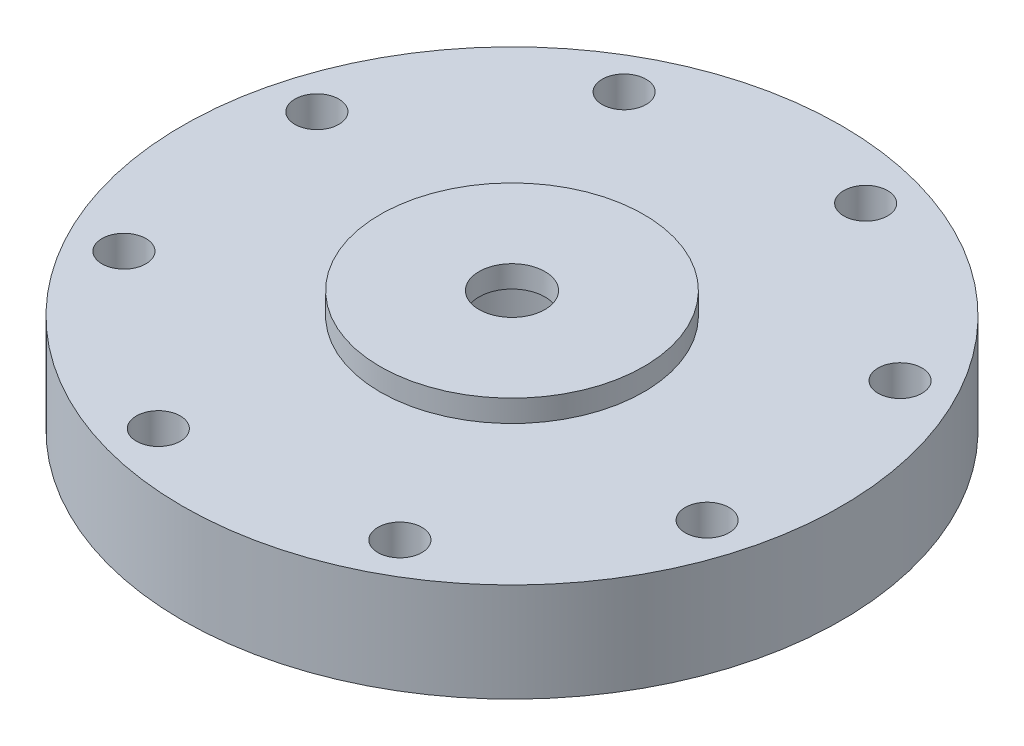
ISO-10303-21;
HEADER;
FILE_DESCRIPTION(('STEP AP214'),'2;1');
FILE_NAME('part.step','',(''),(''),'','','');
FILE_SCHEMA(('AUTOMOTIVE_DESIGN { 1 0 10303 214 1 1 1 1 }'));
ENDSEC;
DATA;
#1=APPLICATION_CONTEXT('core data for automotive mechanical design processes');
#2=APPLICATION_PROTOCOL_DEFINITION('international standard','automotive_design',2000,#1);
#3=PRODUCT_CONTEXT('',#1,'mechanical');
#4=PRODUCT('Part','Part','',(#3));
#5=PRODUCT_RELATED_PRODUCT_CATEGORY('part','',(#4));
#6=PRODUCT_DEFINITION_FORMATION('','',#4);
#7=PRODUCT_DEFINITION_CONTEXT('part definition',#1,'design');
#8=PRODUCT_DEFINITION('design','',#6,#7);
#9=PRODUCT_DEFINITION_SHAPE('','',#8);
#10=(LENGTH_UNIT() NAMED_UNIT(*) SI_UNIT(.MILLI.,.METRE.));
#11=(NAMED_UNIT(*) PLANE_ANGLE_UNIT() SI_UNIT($,.RADIAN.));
#12=(NAMED_UNIT(*) SI_UNIT($,.STERADIAN.) SOLID_ANGLE_UNIT());
#13=UNCERTAINTY_MEASURE_WITH_UNIT(LENGTH_MEASURE(1.E-05),#10,'distance_accuracy_value','');
#14=(GEOMETRIC_REPRESENTATION_CONTEXT(3) GLOBAL_UNCERTAINTY_ASSIGNED_CONTEXT((#13)) GLOBAL_UNIT_ASSIGNED_CONTEXT((#10,
#11,#12)) REPRESENTATION_CONTEXT('',''));
#15=CARTESIAN_POINT('',(0.,0.,0.));
#16=DIRECTION('',(0.,0.,1.));
#17=DIRECTION('',(1.,0.,0.));
#18=AXIS2_PLACEMENT_3D('',#15,#16,#17);
#19=CARTESIAN_POINT('',(0.,2.25,0.));
#20=DIRECTION('',(0.,-1.,0.));
#21=DIRECTION('',(0.,0.,-1.));
#22=AXIS2_PLACEMENT_3D('',#19,#20,#21);
#23=CYLINDRICAL_SURFACE('',#22,15.);
#24=CARTESIAN_POINT('',(0.,2.25,0.));
#25=DIRECTION('',(0.,1.,0.));
#26=DIRECTION('',(0.,0.,1.));
#27=AXIS2_PLACEMENT_3D('',#24,#25,#26);
#28=CIRCLE('',#27,15.);
#29=CARTESIAN_POINT('',(0.,2.25,15.));
#30=VERTEX_POINT('',#29);
#31=EDGE_CURVE('E45',#30,#30,#28,.T.);
#32=ORIENTED_EDGE('',*,*,#31,.F.);
#33=EDGE_LOOP('',(#32));
#34=FACE_BOUND('',#33,.T.);
#35=CARTESIAN_POINT('',(0.,-2.25,0.));
#36=DIRECTION('',(0.,1.,0.));
#37=DIRECTION('',(0.,0.,1.));
#38=AXIS2_PLACEMENT_3D('',#35,#36,#37);
#39=CIRCLE('',#38,15.);
#40=CARTESIAN_POINT('',(0.,-2.25,15.));
#41=VERTEX_POINT('',#40);
#42=EDGE_CURVE('E51',#41,#41,#39,.T.);
#43=ORIENTED_EDGE('',*,*,#42,.T.);
#44=EDGE_LOOP('',(#43));
#45=FACE_BOUND('',#44,.T.);
#46=ADVANCED_FACE('F37',(#34,#45),#23,.T.);
#47=CARTESIAN_POINT('',(0.,2.25,0.));
#48=DIRECTION('',(0.,1.,0.));
#49=DIRECTION('',(0.,0.,1.));
#50=AXIS2_PLACEMENT_3D('',#47,#48,#49);
#51=PLANE('',#50);
#52=CARTESIAN_POINT('',(-3.60811723817874,2.25,12.4892549816055));
#53=DIRECTION('',(0.,1.,0.));
#54=DIRECTION('',(0.,0.,1.));
#55=AXIS2_PLACEMENT_3D('',#52,#53,#54);
#56=CIRCLE('',#55,1.);
#57=CARTESIAN_POINT('',(-3.60811723817874,2.25,13.4892549816055));
#58=VERTEX_POINT('',#57);
#59=EDGE_CURVE('E129',#58,#58,#56,.T.);
#60=ORIENTED_EDGE('',*,*,#59,.F.);
#61=EDGE_LOOP('',(#60));
#62=FACE_BOUND('',#61,.T.);
#63=CARTESIAN_POINT('',(6.27991272302886,2.25,11.3825610558934));
#64=DIRECTION('',(0.,1.,0.));
#65=DIRECTION('',(0.,0.,1.));
#66=AXIS2_PLACEMENT_3D('',#63,#64,#65);
#67=CIRCLE('',#66,1.);
#68=CARTESIAN_POINT('',(6.27991272302886,2.25,12.3825610558934));
#69=VERTEX_POINT('',#68);
#70=EDGE_CURVE('E133',#69,#69,#67,.T.);
#71=ORIENTED_EDGE('',*,*,#70,.F.);
#72=EDGE_LOOP('',(#71));
#73=FACE_BOUND('',#72,.T.);
#74=CARTESIAN_POINT('',(12.4892549816055,2.25,3.6081172381787));
#75=DIRECTION('',(0.,1.,0.));
#76=DIRECTION('',(0.,0.,1.));
#77=AXIS2_PLACEMENT_3D('',#74,#75,#76);
#78=CIRCLE('',#77,1.);
#79=CARTESIAN_POINT('',(12.4892549816055,2.25,4.6081172381787));
#80=VERTEX_POINT('',#79);
#81=EDGE_CURVE('E137',#80,#80,#78,.T.);
#82=ORIENTED_EDGE('',*,*,#81,.F.);
#83=EDGE_LOOP('',(#82));
#84=FACE_BOUND('',#83,.T.);
#85=CARTESIAN_POINT('',(11.3825610558933,2.25,-6.2799127230289));
#86=DIRECTION('',(0.,1.,0.));
#87=DIRECTION('',(0.,0.,1.));
#88=AXIS2_PLACEMENT_3D('',#85,#86,#87);
#89=CIRCLE('',#88,1.);
#90=CARTESIAN_POINT('',(11.3825610558933,2.25,-5.2799127230289));
#91=VERTEX_POINT('',#90);
#92=EDGE_CURVE('E141',#91,#91,#89,.T.);
#93=ORIENTED_EDGE('',*,*,#92,.F.);
#94=EDGE_LOOP('',(#93));
#95=FACE_BOUND('',#94,.T.);
#96=CARTESIAN_POINT('',(3.60811723817866,2.25,-12.4892549816055));
#97=DIRECTION('',(0.,1.,0.));
#98=DIRECTION('',(0.,0.,1.));
#99=AXIS2_PLACEMENT_3D('',#96,#97,#98);
#100=CIRCLE('',#99,1.);
#101=CARTESIAN_POINT('',(3.60811723817866,2.25,-11.4892549816055));
#102=VERTEX_POINT('',#101);
#103=EDGE_CURVE('E145',#102,#102,#100,.T.);
#104=ORIENTED_EDGE('',*,*,#103,.F.);
#105=EDGE_LOOP('',(#104));
#106=FACE_BOUND('',#105,.T.);
#107=CARTESIAN_POINT('',(-6.27991272302894,2.25,-11.3825610558933));
#108=DIRECTION('',(0.,1.,0.));
#109=DIRECTION('',(0.,0.,1.));
#110=AXIS2_PLACEMENT_3D('',#107,#108,#109);
#111=CIRCLE('',#110,1.);
#112=CARTESIAN_POINT('',(-6.27991272302894,2.25,-10.3825610558933));
#113=VERTEX_POINT('',#112);
#114=EDGE_CURVE('E149',#113,#113,#111,.T.);
#115=ORIENTED_EDGE('',*,*,#114,.F.);
#116=EDGE_LOOP('',(#115));
#117=FACE_BOUND('',#116,.T.);
#118=CARTESIAN_POINT('',(-12.4892549816055,2.25,-3.60811723817861));
#119=DIRECTION('',(0.,1.,0.));
#120=DIRECTION('',(0.,0.,1.));
#121=AXIS2_PLACEMENT_3D('',#118,#119,#120);
#122=CIRCLE('',#121,0.999999999999999);
#123=CARTESIAN_POINT('',(-12.4892549816055,2.25,-2.60811723817861));
#124=VERTEX_POINT('',#123);
#125=EDGE_CURVE('E153',#124,#124,#122,.T.);
#126=ORIENTED_EDGE('',*,*,#125,.F.);
#127=EDGE_LOOP('',(#126));
#128=FACE_BOUND('',#127,.T.);
#129=CARTESIAN_POINT('',(-11.3825610558933,2.25,6.27991272302898));
#130=DIRECTION('',(0.,1.,0.));
#131=DIRECTION('',(0.,0.,1.));
#132=AXIS2_PLACEMENT_3D('',#129,#130,#131);
#133=CIRCLE('',#132,1.);
#134=CARTESIAN_POINT('',(-11.3825610558933,2.25,7.27991272302898));
#135=VERTEX_POINT('',#134);
#136=EDGE_CURVE('E65',#135,#135,#133,.T.);
#137=ORIENTED_EDGE('',*,*,#136,.F.);
#138=EDGE_LOOP('',(#137));
#139=FACE_BOUND('',#138,.T.);
#140=CARTESIAN_POINT('',(0.,2.25,0.));
#141=DIRECTION('',(0.,1.,0.));
#142=DIRECTION('',(0.,0.,1.));
#143=AXIS2_PLACEMENT_3D('',#140,#141,#142);
#144=CIRCLE('',#143,6.);
#145=CARTESIAN_POINT('',(0.,2.25,6.));
#146=VERTEX_POINT('',#145);
#147=EDGE_CURVE('E10',#146,#146,#144,.T.);
#148=ORIENTED_EDGE('',*,*,#147,.F.);
#149=EDGE_LOOP('',(#148));
#150=FACE_BOUND('',#149,.T.);
#151=ORIENTED_EDGE('',*,*,#31,.T.);
#152=EDGE_LOOP('',(#151));
#153=FACE_BOUND('',#152,.T.);
#154=ADVANCED_FACE('F110',(#62,#73,#84,#95,#106,#117,#128,#139,#150,#153),#51,.T.);
#155=CARTESIAN_POINT('',(0.,-2.25,0.));
#156=DIRECTION('',(0.,1.,0.));
#157=DIRECTION('',(0.,0.,1.));
#158=AXIS2_PLACEMENT_3D('',#155,#156,#157);
#159=PLANE('',#158);
#160=CARTESIAN_POINT('',(0.,-2.25,0.));
#161=DIRECTION('',(0.,-1.,0.));
#162=DIRECTION('',(0.,0.,-1.));
#163=AXIS2_PLACEMENT_3D('',#160,#161,#162);
#164=CIRCLE('',#163,4.);
#165=CARTESIAN_POINT('',(0.,-2.25,-4.));
#166=VERTEX_POINT('',#165);
#167=EDGE_CURVE('E175',#166,#166,#164,.T.);
#168=ORIENTED_EDGE('',*,*,#167,.F.);
#169=EDGE_LOOP('',(#168));
#170=FACE_BOUND('',#169,.T.);
#171=CARTESIAN_POINT('',(-3.60811723817874,-2.25,12.4892549816055));
#172=DIRECTION('',(0.,1.,0.));
#173=DIRECTION('',(0.,0.,1.));
#174=AXIS2_PLACEMENT_3D('',#171,#172,#173);
#175=CIRCLE('',#174,1.);
#176=CARTESIAN_POINT('',(-3.60811723817874,-2.25,13.4892549816055));
#177=VERTEX_POINT('',#176);
#178=EDGE_CURVE('E88',#177,#177,#175,.T.);
#179=ORIENTED_EDGE('',*,*,#178,.T.);
#180=EDGE_LOOP('',(#179));
#181=FACE_BOUND('',#180,.T.);
#182=CARTESIAN_POINT('',(6.27991272302886,-2.25,11.3825610558934));
#183=DIRECTION('',(0.,1.,0.));
#184=DIRECTION('',(0.,0.,1.));
#185=AXIS2_PLACEMENT_3D('',#182,#183,#184);
#186=CIRCLE('',#185,1.);
#187=CARTESIAN_POINT('',(6.27991272302886,-2.25,12.3825610558934));
#188=VERTEX_POINT('',#187);
#189=EDGE_CURVE('E85',#188,#188,#186,.T.);
#190=ORIENTED_EDGE('',*,*,#189,.T.);
#191=EDGE_LOOP('',(#190));
#192=FACE_BOUND('',#191,.T.);
#193=CARTESIAN_POINT('',(12.4892549816055,-2.25,3.6081172381787));
#194=DIRECTION('',(0.,1.,0.));
#195=DIRECTION('',(0.,0.,1.));
#196=AXIS2_PLACEMENT_3D('',#193,#194,#195);
#197=CIRCLE('',#196,1.);
#198=CARTESIAN_POINT('',(12.4892549816055,-2.25,4.6081172381787));
#199=VERTEX_POINT('',#198);
#200=EDGE_CURVE('E81',#199,#199,#197,.T.);
#201=ORIENTED_EDGE('',*,*,#200,.T.);
#202=EDGE_LOOP('',(#201));
#203=FACE_BOUND('',#202,.T.);
#204=CARTESIAN_POINT('',(11.3825610558933,-2.25,-6.2799127230289));
#205=DIRECTION('',(0.,1.,0.));
#206=DIRECTION('',(0.,0.,1.));
#207=AXIS2_PLACEMENT_3D('',#204,#205,#206);
#208=CIRCLE('',#207,1.);
#209=CARTESIAN_POINT('',(11.3825610558933,-2.25,-5.2799127230289));
#210=VERTEX_POINT('',#209);
#211=EDGE_CURVE('E77',#210,#210,#208,.T.);
#212=ORIENTED_EDGE('',*,*,#211,.T.);
#213=EDGE_LOOP('',(#212));
#214=FACE_BOUND('',#213,.T.);
#215=CARTESIAN_POINT('',(3.60811723817866,-2.25,-12.4892549816055));
#216=DIRECTION('',(0.,1.,0.));
#217=DIRECTION('',(0.,0.,1.));
#218=AXIS2_PLACEMENT_3D('',#215,#216,#217);
#219=CIRCLE('',#218,1.);
#220=CARTESIAN_POINT('',(3.60811723817866,-2.25,-11.4892549816055));
#221=VERTEX_POINT('',#220);
#222=EDGE_CURVE('E73',#221,#221,#219,.T.);
#223=ORIENTED_EDGE('',*,*,#222,.T.);
#224=EDGE_LOOP('',(#223));
#225=FACE_BOUND('',#224,.T.);
#226=CARTESIAN_POINT('',(-6.27991272302894,-2.25,-11.3825610558933));
#227=DIRECTION('',(0.,1.,0.));
#228=DIRECTION('',(0.,0.,1.));
#229=AXIS2_PLACEMENT_3D('',#226,#227,#228);
#230=CIRCLE('',#229,1.);
#231=CARTESIAN_POINT('',(-6.27991272302894,-2.25,-10.3825610558933));
#232=VERTEX_POINT('',#231);
#233=EDGE_CURVE('E69',#232,#232,#230,.T.);
#234=ORIENTED_EDGE('',*,*,#233,.T.);
#235=EDGE_LOOP('',(#234));
#236=FACE_BOUND('',#235,.T.);
#237=CARTESIAN_POINT('',(-12.4892549816055,-2.25,-3.60811723817861));
#238=DIRECTION('',(0.,1.,0.));
#239=DIRECTION('',(0.,0.,1.));
#240=AXIS2_PLACEMENT_3D('',#237,#238,#239);
#241=CIRCLE('',#240,0.999999999999999);
#242=CARTESIAN_POINT('',(-12.4892549816055,-2.25,-2.60811723817861));
#243=VERTEX_POINT('',#242);
#244=EDGE_CURVE('E64',#243,#243,#241,.T.);
#245=ORIENTED_EDGE('',*,*,#244,.T.);
#246=EDGE_LOOP('',(#245));
#247=FACE_BOUND('',#246,.T.);
#248=CARTESIAN_POINT('',(-11.3825610558933,-2.25,6.27991272302898));
#249=DIRECTION('',(0.,1.,0.));
#250=DIRECTION('',(0.,0.,1.));
#251=AXIS2_PLACEMENT_3D('',#248,#249,#250);
#252=CIRCLE('',#251,1.);
#253=CARTESIAN_POINT('',(-11.3825610558933,-2.25,7.27991272302898));
#254=VERTEX_POINT('',#253);
#255=EDGE_CURVE('E60',#254,#254,#252,.T.);
#256=ORIENTED_EDGE('',*,*,#255,.T.);
#257=EDGE_LOOP('',(#256));
#258=FACE_BOUND('',#257,.T.);
#259=ORIENTED_EDGE('',*,*,#42,.F.);
#260=EDGE_LOOP('',(#259));
#261=FACE_BOUND('',#260,.T.);
#262=ADVANCED_FACE('F101',(#170,#181,#192,#203,#214,#225,#236,#247,#258,#261),#159,.F.);
#263=CARTESIAN_POINT('',(0.,3.25,0.));
#264=DIRECTION('',(0.,-1.,0.));
#265=DIRECTION('',(0.,0.,-1.));
#266=AXIS2_PLACEMENT_3D('',#263,#264,#265);
#267=CYLINDRICAL_SURFACE('',#266,6.);
#268=CARTESIAN_POINT('',(0.,3.25,0.));
#269=DIRECTION('',(0.,1.,0.));
#270=DIRECTION('',(0.,0.,1.));
#271=AXIS2_PLACEMENT_3D('',#268,#269,#270);
#272=CIRCLE('',#271,6.);
#273=CARTESIAN_POINT('',(0.,3.25,6.));
#274=VERTEX_POINT('',#273);
#275=EDGE_CURVE('E54',#274,#274,#272,.T.);
#276=ORIENTED_EDGE('',*,*,#275,.F.);
#277=EDGE_LOOP('',(#276));
#278=FACE_BOUND('',#277,.T.);
#279=ORIENTED_EDGE('',*,*,#147,.T.);
#280=EDGE_LOOP('',(#279));
#281=FACE_BOUND('',#280,.T.);
#282=ADVANCED_FACE('F99',(#278,#281),#267,.T.);
#283=CARTESIAN_POINT('',(0.,3.25,0.));
#284=DIRECTION('',(0.,1.,0.));
#285=DIRECTION('',(0.,0.,1.));
#286=AXIS2_PLACEMENT_3D('',#283,#284,#285);
#287=PLANE('',#286);
#288=CARTESIAN_POINT('',(0.,3.25,0.));
#289=DIRECTION('',(0.,1.,0.));
#290=DIRECTION('',(0.,0.,1.));
#291=AXIS2_PLACEMENT_3D('',#288,#289,#290);
#292=CIRCLE('',#291,1.5);
#293=CARTESIAN_POINT('',(0.,3.25,1.5));
#294=VERTEX_POINT('',#293);
#295=EDGE_CURVE('E182',#294,#294,#292,.T.);
#296=ORIENTED_EDGE('',*,*,#295,.F.);
#297=EDGE_LOOP('',(#296));
#298=FACE_BOUND('',#297,.T.);
#299=ORIENTED_EDGE('',*,*,#275,.T.);
#300=EDGE_LOOP('',(#299));
#301=FACE_BOUND('',#300,.T.);
#302=ADVANCED_FACE('F97',(#298,#301),#287,.T.);
#303=CARTESIAN_POINT('',(-11.3825610558933,-2.75,6.27991272302898));
#304=DIRECTION('',(0.,1.,0.));
#305=DIRECTION('',(0.,0.,1.));
#306=AXIS2_PLACEMENT_3D('',#303,#304,#305);
#307=CYLINDRICAL_SURFACE('',#306,1.);
#308=ORIENTED_EDGE('',*,*,#136,.T.);
#309=EDGE_LOOP('',(#308));
#310=FACE_BOUND('',#309,.T.);
#311=ORIENTED_EDGE('',*,*,#255,.F.);
#312=EDGE_LOOP('',(#311));
#313=FACE_BOUND('',#312,.T.);
#314=ADVANCED_FACE('F107',(#310,#313),#307,.F.);
#315=CARTESIAN_POINT('',(-12.4892549816055,-2.75,-3.60811723817861));
#316=DIRECTION('',(0.,1.,0.));
#317=DIRECTION('',(0.,0.,1.));
#318=AXIS2_PLACEMENT_3D('',#315,#316,#317);
#319=CYLINDRICAL_SURFACE('',#318,0.999999999999999);
#320=ORIENTED_EDGE('',*,*,#125,.T.);
#321=EDGE_LOOP('',(#320));
#322=FACE_BOUND('',#321,.T.);
#323=ORIENTED_EDGE('',*,*,#244,.F.);
#324=EDGE_LOOP('',(#323));
#325=FACE_BOUND('',#324,.T.);
#326=ADVANCED_FACE('F221',(#322,#325),#319,.F.);
#327=CARTESIAN_POINT('',(-6.27991272302894,-2.75,-11.3825610558933));
#328=DIRECTION('',(0.,1.,0.));
#329=DIRECTION('',(0.,0.,1.));
#330=AXIS2_PLACEMENT_3D('',#327,#328,#329);
#331=CYLINDRICAL_SURFACE('',#330,1.);
#332=ORIENTED_EDGE('',*,*,#114,.T.);
#333=EDGE_LOOP('',(#332));
#334=FACE_BOUND('',#333,.T.);
#335=ORIENTED_EDGE('',*,*,#233,.F.);
#336=EDGE_LOOP('',(#335));
#337=FACE_BOUND('',#336,.T.);
#338=ADVANCED_FACE('F226',(#334,#337),#331,.F.);
#339=CARTESIAN_POINT('',(3.60811723817866,-2.75,-12.4892549816055));
#340=DIRECTION('',(0.,1.,0.));
#341=DIRECTION('',(0.,0.,1.));
#342=AXIS2_PLACEMENT_3D('',#339,#340,#341);
#343=CYLINDRICAL_SURFACE('',#342,1.);
#344=ORIENTED_EDGE('',*,*,#103,.T.);
#345=EDGE_LOOP('',(#344));
#346=FACE_BOUND('',#345,.T.);
#347=ORIENTED_EDGE('',*,*,#222,.F.);
#348=EDGE_LOOP('',(#347));
#349=FACE_BOUND('',#348,.T.);
#350=ADVANCED_FACE('F244',(#346,#349),#343,.F.);
#351=CARTESIAN_POINT('',(11.3825610558933,-2.75,-6.2799127230289));
#352=DIRECTION('',(0.,1.,0.));
#353=DIRECTION('',(0.,0.,1.));
#354=AXIS2_PLACEMENT_3D('',#351,#352,#353);
#355=CYLINDRICAL_SURFACE('',#354,1.);
#356=ORIENTED_EDGE('',*,*,#92,.T.);
#357=EDGE_LOOP('',(#356));
#358=FACE_BOUND('',#357,.T.);
#359=ORIENTED_EDGE('',*,*,#211,.F.);
#360=EDGE_LOOP('',(#359));
#361=FACE_BOUND('',#360,.T.);
#362=ADVANCED_FACE('F240',(#358,#361),#355,.F.);
#363=CARTESIAN_POINT('',(12.4892549816055,-2.75,3.6081172381787));
#364=DIRECTION('',(0.,1.,0.));
#365=DIRECTION('',(0.,0.,1.));
#366=AXIS2_PLACEMENT_3D('',#363,#364,#365);
#367=CYLINDRICAL_SURFACE('',#366,1.);
#368=ORIENTED_EDGE('',*,*,#81,.T.);
#369=EDGE_LOOP('',(#368));
#370=FACE_BOUND('',#369,.T.);
#371=ORIENTED_EDGE('',*,*,#200,.F.);
#372=EDGE_LOOP('',(#371));
#373=FACE_BOUND('',#372,.T.);
#374=ADVANCED_FACE('F236',(#370,#373),#367,.F.);
#375=CARTESIAN_POINT('',(6.27991272302886,-2.75,11.3825610558934));
#376=DIRECTION('',(0.,1.,0.));
#377=DIRECTION('',(0.,0.,1.));
#378=AXIS2_PLACEMENT_3D('',#375,#376,#377);
#379=CYLINDRICAL_SURFACE('',#378,1.);
#380=ORIENTED_EDGE('',*,*,#70,.T.);
#381=EDGE_LOOP('',(#380));
#382=FACE_BOUND('',#381,.T.);
#383=ORIENTED_EDGE('',*,*,#189,.F.);
#384=EDGE_LOOP('',(#383));
#385=FACE_BOUND('',#384,.T.);
#386=ADVANCED_FACE('F232',(#382,#385),#379,.F.);
#387=CARTESIAN_POINT('',(-3.60811723817874,-2.75,12.4892549816055));
#388=DIRECTION('',(0.,1.,0.));
#389=DIRECTION('',(0.,0.,1.));
#390=AXIS2_PLACEMENT_3D('',#387,#388,#389);
#391=CYLINDRICAL_SURFACE('',#390,1.);
#392=ORIENTED_EDGE('',*,*,#59,.T.);
#393=EDGE_LOOP('',(#392));
#394=FACE_BOUND('',#393,.T.);
#395=ORIENTED_EDGE('',*,*,#178,.F.);
#396=EDGE_LOOP('',(#395));
#397=FACE_BOUND('',#396,.T.);
#398=ADVANCED_FACE('F202',(#394,#397),#391,.F.);
#399=CARTESIAN_POINT('',(0.,2.25,0.));
#400=DIRECTION('',(0.,-1.,0.));
#401=DIRECTION('',(0.,0.,-1.));
#402=AXIS2_PLACEMENT_3D('',#399,#400,#401);
#403=CYLINDRICAL_SURFACE('',#402,4.);
#404=CARTESIAN_POINT('',(0.,2.25,0.));
#405=DIRECTION('',(0.,-1.,0.));
#406=DIRECTION('',(0.,0.,-1.));
#407=AXIS2_PLACEMENT_3D('',#404,#405,#406);
#408=CIRCLE('',#407,4.);
#409=CARTESIAN_POINT('',(0.,2.25,-4.));
#410=VERTEX_POINT('',#409);
#411=EDGE_CURVE('E164',#410,#410,#408,.T.);
#412=ORIENTED_EDGE('',*,*,#411,.F.);
#413=EDGE_LOOP('',(#412));
#414=FACE_BOUND('',#413,.T.);
#415=ORIENTED_EDGE('',*,*,#167,.T.);
#416=EDGE_LOOP('',(#415));
#417=FACE_BOUND('',#416,.T.);
#418=ADVANCED_FACE('F196',(#414,#417),#403,.F.);
#419=CARTESIAN_POINT('',(0.,2.25,0.));
#420=DIRECTION('',(0.,-1.,0.));
#421=DIRECTION('',(0.,0.,-1.));
#422=AXIS2_PLACEMENT_3D('',#419,#420,#421);
#423=PLANE('',#422);
#424=CARTESIAN_POINT('',(0.,2.25,0.));
#425=DIRECTION('',(0.,-1.,0.));
#426=DIRECTION('',(0.,0.,-1.));
#427=AXIS2_PLACEMENT_3D('',#424,#425,#426);
#428=CIRCLE('',#427,1.5);
#429=CARTESIAN_POINT('',(0.,2.25,-1.5));
#430=VERTEX_POINT('',#429);
#431=EDGE_CURVE('E40',#430,#430,#428,.T.);
#432=ORIENTED_EDGE('',*,*,#431,.F.);
#433=EDGE_LOOP('',(#432));
#434=FACE_BOUND('',#433,.T.);
#435=ORIENTED_EDGE('',*,*,#411,.T.);
#436=EDGE_LOOP('',(#435));
#437=FACE_BOUND('',#436,.T.);
#438=ADVANCED_FACE('F193',(#434,#437),#423,.T.);
#439=CARTESIAN_POINT('',(0.,-1.25,0.));
#440=DIRECTION('',(0.,1.,0.));
#441=DIRECTION('',(0.,0.,1.));
#442=AXIS2_PLACEMENT_3D('',#439,#440,#441);
#443=CYLINDRICAL_SURFACE('',#442,1.5);
#444=ORIENTED_EDGE('',*,*,#431,.T.);
#445=EDGE_LOOP('',(#444));
#446=FACE_BOUND('',#445,.T.);
#447=ORIENTED_EDGE('',*,*,#295,.T.);
#448=EDGE_LOOP('',(#447));
#449=FACE_BOUND('',#448,.T.);
#450=ADVANCED_FACE('F191',(#446,#449),#443,.F.);
#451=CLOSED_SHELL('',(#46,#154,#262,#282,#302,#314,#326,#338,#350,#362,#374,#386,#398,#418,#438,#450));
#452=MANIFOLD_SOLID_BREP('B2',#451);
#453=ADVANCED_BREP_SHAPE_REPRESENTATION('',(#18,#452),#14);
#454=SHAPE_DEFINITION_REPRESENTATION(#9,#453);
ENDSEC;
END-ISO-10303-21;
